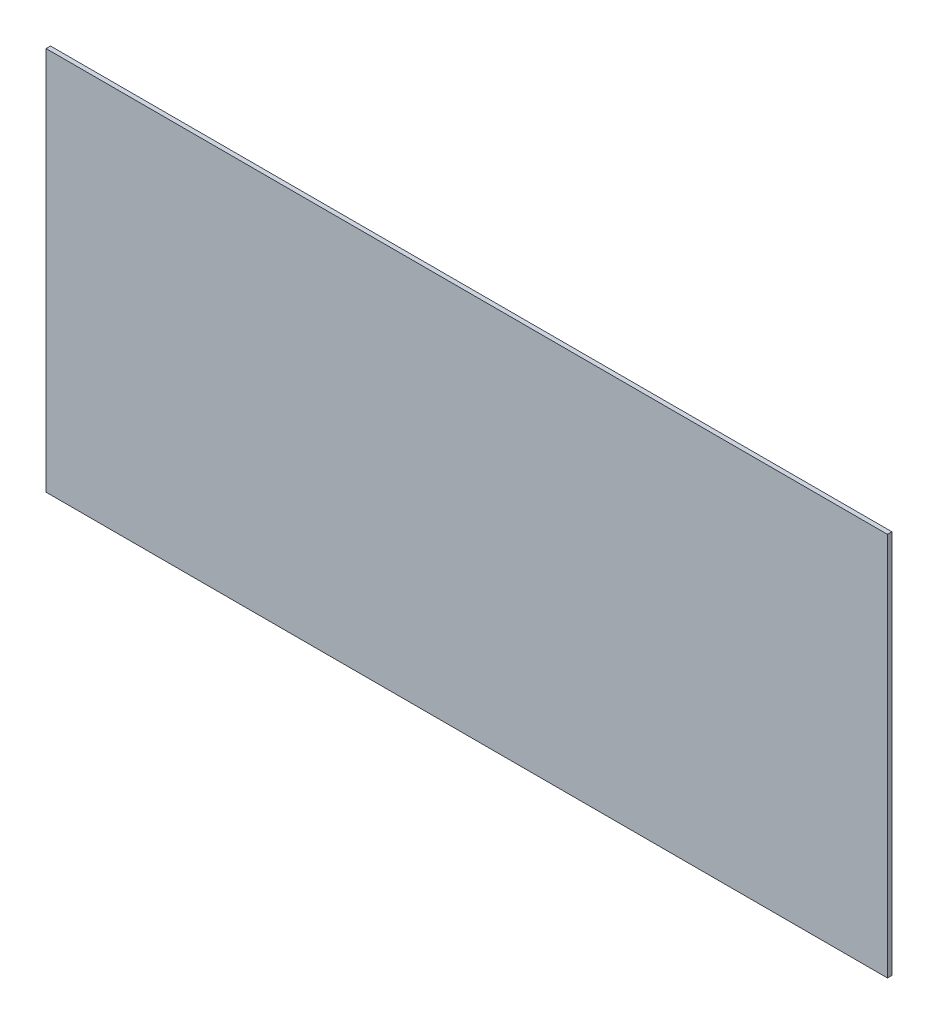
ISO-10303-21;
HEADER;
FILE_DESCRIPTION(('STEP AP214'),'2;1');
FILE_NAME('part.step','',(''),(''),'','','');
FILE_SCHEMA(('AUTOMOTIVE_DESIGN { 1 0 10303 214 1 1 1 1 }'));
ENDSEC;
DATA;
#1=APPLICATION_CONTEXT('core data for automotive mechanical design processes');
#2=APPLICATION_PROTOCOL_DEFINITION('international standard','automotive_design',2000,#1);
#3=PRODUCT_CONTEXT('',#1,'mechanical');
#4=PRODUCT('Part','Part','',(#3));
#5=PRODUCT_RELATED_PRODUCT_CATEGORY('part','',(#4));
#6=PRODUCT_DEFINITION_FORMATION('','',#4);
#7=PRODUCT_DEFINITION_CONTEXT('part definition',#1,'design');
#8=PRODUCT_DEFINITION('design','',#6,#7);
#9=PRODUCT_DEFINITION_SHAPE('','',#8);
#10=(LENGTH_UNIT() NAMED_UNIT(*) SI_UNIT(.MILLI.,.METRE.));
#11=(NAMED_UNIT(*) PLANE_ANGLE_UNIT() SI_UNIT($,.RADIAN.));
#12=(NAMED_UNIT(*) SI_UNIT($,.STERADIAN.) SOLID_ANGLE_UNIT());
#13=UNCERTAINTY_MEASURE_WITH_UNIT(LENGTH_MEASURE(1.E-05),#10,'distance_accuracy_value','');
#14=(GEOMETRIC_REPRESENTATION_CONTEXT(3) GLOBAL_UNCERTAINTY_ASSIGNED_CONTEXT((#13)) GLOBAL_UNIT_ASSIGNED_CONTEXT((#10,
#11,#12)) REPRESENTATION_CONTEXT('',''));
#15=CARTESIAN_POINT('',(0.,0.,0.));
#16=DIRECTION('',(0.,0.,1.));
#17=DIRECTION('',(1.,0.,0.));
#18=AXIS2_PLACEMENT_3D('',#15,#16,#17);
#19=CARTESIAN_POINT('',(-674.68068833652,225.195028680688,5.));
#20=DIRECTION('',(1.,0.,0.));
#21=DIRECTION('',(0.,1.,0.));
#22=AXIS2_PLACEMENT_3D('',#19,#20,#21);
#23=PLANE('',#22);
#24=DIRECTION('',(0.,-1.,0.));
#25=VECTOR('',#24,1.);
#26=CARTESIAN_POINT('',(-674.68068833652,225.195028680688,0.));
#27=LINE('',#26,#25);
#28=CARTESIAN_POINT('',(-674.68068833652,225.195028680688,0.));
#29=VERTEX_POINT('',#28);
#30=CARTESIAN_POINT('',(-674.68068833652,-206.804971319312,0.));
#31=VERTEX_POINT('',#30);
#32=EDGE_CURVE('E96',#29,#31,#27,.T.);
#33=ORIENTED_EDGE('',*,*,#32,.T.);
#34=DIRECTION('',(0.,0.,-1.));
#35=VECTOR('',#34,1.);
#36=CARTESIAN_POINT('',(-674.68068833652,-206.804971319312,5.));
#37=LINE('',#36,#35);
#38=CARTESIAN_POINT('',(-674.68068833652,-206.804971319312,5.));
#39=VERTEX_POINT('',#38);
#40=EDGE_CURVE('E11',#39,#31,#37,.T.);
#41=ORIENTED_EDGE('',*,*,#40,.F.);
#42=DIRECTION('',(0.,-1.,0.));
#43=VECTOR('',#42,1.);
#44=CARTESIAN_POINT('',(-674.68068833652,225.195028680688,5.));
#45=LINE('',#44,#43);
#46=CARTESIAN_POINT('',(-674.68068833652,225.195028680688,5.));
#47=VERTEX_POINT('',#46);
#48=EDGE_CURVE('E84',#47,#39,#45,.T.);
#49=ORIENTED_EDGE('',*,*,#48,.F.);
#50=DIRECTION('',(0.,0.,-1.));
#51=VECTOR('',#50,1.);
#52=CARTESIAN_POINT('',(-674.68068833652,225.195028680688,5.));
#53=LINE('',#52,#51);
#54=EDGE_CURVE('E92',#47,#29,#53,.T.);
#55=ORIENTED_EDGE('',*,*,#54,.T.);
#56=EDGE_LOOP('',(#33,#41,#49,#55));
#57=FACE_BOUND('',#56,.T.);
#58=ADVANCED_FACE('F33',(#57),#23,.F.);
#59=CARTESIAN_POINT('',(-674.68068833652,-206.804971319312,5.));
#60=DIRECTION('',(0.,1.,0.));
#61=DIRECTION('',(0.,0.,1.));
#62=AXIS2_PLACEMENT_3D('',#59,#60,#61);
#63=PLANE('',#62);
#64=DIRECTION('',(1.,0.,0.));
#65=VECTOR('',#64,1.);
#66=CARTESIAN_POINT('',(-674.68068833652,-206.804971319312,0.));
#67=LINE('',#66,#65);
#68=CARTESIAN_POINT('',(271.31931166348,-206.804971319312,0.));
#69=VERTEX_POINT('',#68);
#70=EDGE_CURVE('E88',#31,#69,#67,.T.);
#71=ORIENTED_EDGE('',*,*,#70,.T.);
#72=DIRECTION('',(0.,0.,-1.));
#73=VECTOR('',#72,1.);
#74=CARTESIAN_POINT('',(271.31931166348,-206.804971319312,5.));
#75=LINE('',#74,#73);
#76=CARTESIAN_POINT('',(271.31931166348,-206.804971319312,5.));
#77=VERTEX_POINT('',#76);
#78=EDGE_CURVE('E41',#77,#69,#75,.T.);
#79=ORIENTED_EDGE('',*,*,#78,.F.);
#80=DIRECTION('',(1.,0.,0.));
#81=VECTOR('',#80,1.);
#82=CARTESIAN_POINT('',(-674.68068833652,-206.804971319312,5.));
#83=LINE('',#82,#81);
#84=EDGE_CURVE('E79',#39,#77,#83,.T.);
#85=ORIENTED_EDGE('',*,*,#84,.F.);
#86=ORIENTED_EDGE('',*,*,#40,.T.);
#87=EDGE_LOOP('',(#71,#79,#85,#86));
#88=FACE_BOUND('',#87,.T.);
#89=ADVANCED_FACE('F87',(#88),#63,.F.);
#90=CARTESIAN_POINT('',(271.31931166348,225.195028680688,5.));
#91=DIRECTION('',(-1.,0.,0.));
#92=DIRECTION('',(0.,0.,1.));
#93=AXIS2_PLACEMENT_3D('',#90,#91,#92);
#94=PLANE('',#93);
#95=DIRECTION('',(0.,1.,0.));
#96=VECTOR('',#95,1.);
#97=CARTESIAN_POINT('',(271.31931166348,225.195028680688,0.));
#98=LINE('',#97,#96);
#99=CARTESIAN_POINT('',(271.31931166348,225.195028680688,0.));
#100=VERTEX_POINT('',#99);
#101=EDGE_CURVE('E66',#69,#100,#98,.T.);
#102=ORIENTED_EDGE('',*,*,#101,.T.);
#103=DIRECTION('',(0.,0.,-1.));
#104=VECTOR('',#103,1.);
#105=CARTESIAN_POINT('',(271.31931166348,225.195028680688,5.));
#106=LINE('',#105,#104);
#107=CARTESIAN_POINT('',(271.31931166348,225.195028680688,5.));
#108=VERTEX_POINT('',#107);
#109=EDGE_CURVE('E89',#108,#100,#106,.T.);
#110=ORIENTED_EDGE('',*,*,#109,.F.);
#111=DIRECTION('',(0.,1.,0.));
#112=VECTOR('',#111,1.);
#113=CARTESIAN_POINT('',(271.31931166348,225.195028680688,5.));
#114=LINE('',#113,#112);
#115=EDGE_CURVE('E82',#77,#108,#114,.T.);
#116=ORIENTED_EDGE('',*,*,#115,.F.);
#117=ORIENTED_EDGE('',*,*,#78,.T.);
#118=EDGE_LOOP('',(#102,#110,#116,#117));
#119=FACE_BOUND('',#118,.T.);
#120=ADVANCED_FACE('F90',(#119),#94,.F.);
#121=CARTESIAN_POINT('',(-674.68068833652,225.195028680688,5.));
#122=DIRECTION('',(0.,-1.,0.));
#123=DIRECTION('',(0.,0.,-1.));
#124=AXIS2_PLACEMENT_3D('',#121,#122,#123);
#125=PLANE('',#124);
#126=DIRECTION('',(-1.,0.,0.));
#127=VECTOR('',#126,1.);
#128=CARTESIAN_POINT('',(-674.68068833652,225.195028680688,0.));
#129=LINE('',#128,#127);
#130=EDGE_CURVE('E72',#100,#29,#129,.T.);
#131=ORIENTED_EDGE('',*,*,#130,.T.);
#132=ORIENTED_EDGE('',*,*,#54,.F.);
#133=DIRECTION('',(-1.,0.,0.));
#134=VECTOR('',#133,1.);
#135=CARTESIAN_POINT('',(-674.68068833652,225.195028680688,5.));
#136=LINE('',#135,#134);
#137=EDGE_CURVE('E49',#108,#47,#136,.T.);
#138=ORIENTED_EDGE('',*,*,#137,.F.);
#139=ORIENTED_EDGE('',*,*,#109,.T.);
#140=EDGE_LOOP('',(#131,#132,#138,#139));
#141=FACE_BOUND('',#140,.T.);
#142=ADVANCED_FACE('F103',(#141),#125,.F.);
#143=CARTESIAN_POINT('',(0.,0.,5.));
#144=DIRECTION('',(0.,0.,1.));
#145=DIRECTION('',(1.,0.,0.));
#146=AXIS2_PLACEMENT_3D('',#143,#144,#145);
#147=PLANE('',#146);
#148=ORIENTED_EDGE('',*,*,#48,.T.);
#149=ORIENTED_EDGE('',*,*,#84,.T.);
#150=ORIENTED_EDGE('',*,*,#115,.T.);
#151=ORIENTED_EDGE('',*,*,#137,.T.);
#152=EDGE_LOOP('',(#148,#149,#150,#151));
#153=FACE_BOUND('',#152,.T.);
#154=ADVANCED_FACE('F80',(#153),#147,.T.);
#155=CARTESIAN_POINT('',(0.,0.,0.));
#156=DIRECTION('',(0.,0.,1.));
#157=DIRECTION('',(1.,0.,0.));
#158=AXIS2_PLACEMENT_3D('',#155,#156,#157);
#159=PLANE('',#158);
#160=ORIENTED_EDGE('',*,*,#32,.F.);
#161=ORIENTED_EDGE('',*,*,#130,.F.);
#162=ORIENTED_EDGE('',*,*,#101,.F.);
#163=ORIENTED_EDGE('',*,*,#70,.F.);
#164=EDGE_LOOP('',(#160,#161,#162,#163));
#165=FACE_BOUND('',#164,.T.);
#166=ADVANCED_FACE('F106',(#165),#159,.F.);
#167=CLOSED_SHELL('',(#58,#89,#120,#142,#154,#166));
#168=MANIFOLD_SOLID_BREP('B2',#167);
#169=ADVANCED_BREP_SHAPE_REPRESENTATION('',(#18,#168),#14);
#170=SHAPE_DEFINITION_REPRESENTATION(#9,#169);
ENDSEC;
END-ISO-10303-21;
